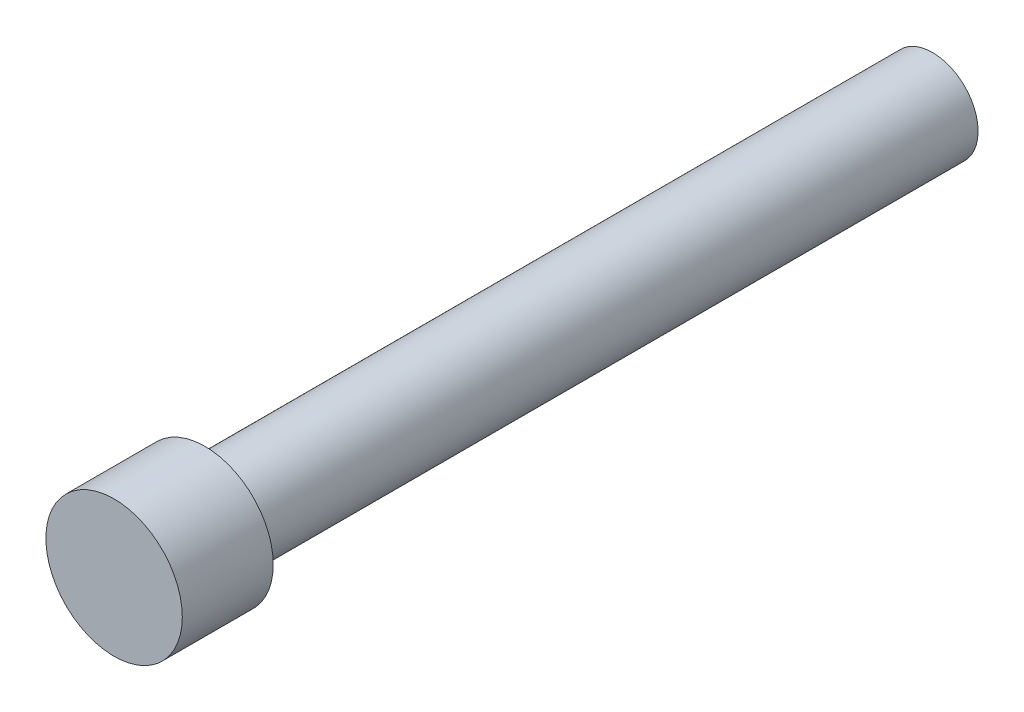
ISO-10303-21;
HEADER;
FILE_DESCRIPTION(('STEP AP214'),'2;1');
FILE_NAME('part.step','',(''),(''),'','','');
FILE_SCHEMA(('AUTOMOTIVE_DESIGN { 1 0 10303 214 1 1 1 1 }'));
ENDSEC;
DATA;
#1=APPLICATION_CONTEXT('core data for automotive mechanical design processes');
#2=APPLICATION_PROTOCOL_DEFINITION('international standard','automotive_design',2000,#1);
#3=PRODUCT_CONTEXT('',#1,'mechanical');
#4=PRODUCT('Part','Part','',(#3));
#5=PRODUCT_RELATED_PRODUCT_CATEGORY('part','',(#4));
#6=PRODUCT_DEFINITION_FORMATION('','',#4);
#7=PRODUCT_DEFINITION_CONTEXT('part definition',#1,'design');
#8=PRODUCT_DEFINITION('design','',#6,#7);
#9=PRODUCT_DEFINITION_SHAPE('','',#8);
#10=(LENGTH_UNIT() NAMED_UNIT(*) SI_UNIT(.MILLI.,.METRE.));
#11=(NAMED_UNIT(*) PLANE_ANGLE_UNIT() SI_UNIT($,.RADIAN.));
#12=(NAMED_UNIT(*) SI_UNIT($,.STERADIAN.) SOLID_ANGLE_UNIT());
#13=UNCERTAINTY_MEASURE_WITH_UNIT(LENGTH_MEASURE(1.E-05),#10,'distance_accuracy_value','');
#14=(GEOMETRIC_REPRESENTATION_CONTEXT(3) GLOBAL_UNCERTAINTY_ASSIGNED_CONTEXT((#13)) GLOBAL_UNIT_ASSIGNED_CONTEXT((#10,
#11,#12)) REPRESENTATION_CONTEXT('',''));
#15=CARTESIAN_POINT('',(0.,0.,0.));
#16=DIRECTION('',(0.,0.,1.));
#17=DIRECTION('',(1.,0.,0.));
#18=AXIS2_PLACEMENT_3D('',#15,#16,#17);
#19=CARTESIAN_POINT('',(0.,0.,2.));
#20=DIRECTION('',(0.,0.,-1.));
#21=DIRECTION('',(-1.,0.,0.));
#22=AXIS2_PLACEMENT_3D('',#19,#20,#21);
#23=CYLINDRICAL_SURFACE('',#22,1.5);
#24=CARTESIAN_POINT('',(0.,0.,2.));
#25=DIRECTION('',(0.,0.,1.));
#26=DIRECTION('',(1.,0.,0.));
#27=AXIS2_PLACEMENT_3D('',#24,#25,#26);
#28=CIRCLE('',#27,1.5);
#29=CARTESIAN_POINT('',(1.5,0.,2.));
#30=VERTEX_POINT('',#29);
#31=EDGE_CURVE('E45',#30,#30,#28,.T.);
#32=ORIENTED_EDGE('',*,*,#31,.F.);
#33=EDGE_LOOP('',(#32));
#34=FACE_BOUND('',#33,.T.);
#35=CARTESIAN_POINT('',(0.,0.,0.));
#36=DIRECTION('',(0.,0.,1.));
#37=DIRECTION('',(1.,0.,0.));
#38=AXIS2_PLACEMENT_3D('',#35,#36,#37);
#39=CIRCLE('',#38,1.5);
#40=CARTESIAN_POINT('',(1.5,0.,0.));
#41=VERTEX_POINT('',#40);
#42=EDGE_CURVE('E40',#41,#41,#39,.T.);
#43=ORIENTED_EDGE('',*,*,#42,.T.);
#44=EDGE_LOOP('',(#43));
#45=FACE_BOUND('',#44,.T.);
#46=ADVANCED_FACE('F37',(#34,#45),#23,.T.);
#47=CARTESIAN_POINT('',(0.,0.,2.));
#48=DIRECTION('',(0.,0.,1.));
#49=DIRECTION('',(1.,0.,0.));
#50=AXIS2_PLACEMENT_3D('',#47,#48,#49);
#51=PLANE('',#50);
#52=ORIENTED_EDGE('',*,*,#31,.T.);
#53=EDGE_LOOP('',(#52));
#54=FACE_BOUND('',#53,.T.);
#55=ADVANCED_FACE('F65',(#54),#51,.T.);
#56=CARTESIAN_POINT('',(0.,0.,0.));
#57=DIRECTION('',(0.,0.,1.));
#58=DIRECTION('',(1.,0.,0.));
#59=AXIS2_PLACEMENT_3D('',#56,#57,#58);
#60=PLANE('',#59);
#61=CARTESIAN_POINT('',(0.,0.,0.));
#62=DIRECTION('',(0.,0.,-1.));
#63=DIRECTION('',(-1.,0.,0.));
#64=AXIS2_PLACEMENT_3D('',#61,#62,#63);
#65=CIRCLE('',#64,1.);
#66=CARTESIAN_POINT('',(-1.,0.,0.));
#67=VERTEX_POINT('',#66);
#68=EDGE_CURVE('E10',#67,#67,#65,.T.);
#69=ORIENTED_EDGE('',*,*,#68,.F.);
#70=EDGE_LOOP('',(#69));
#71=FACE_BOUND('',#70,.T.);
#72=ORIENTED_EDGE('',*,*,#42,.F.);
#73=EDGE_LOOP('',(#72));
#74=FACE_BOUND('',#73,.T.);
#75=ADVANCED_FACE('F62',(#71,#74),#60,.F.);
#76=CARTESIAN_POINT('',(0.,0.,-16.));
#77=DIRECTION('',(0.,0.,1.));
#78=DIRECTION('',(1.,0.,0.));
#79=AXIS2_PLACEMENT_3D('',#76,#77,#78);
#80=CYLINDRICAL_SURFACE('',#79,1.);
#81=CARTESIAN_POINT('',(0.,0.,-16.));
#82=DIRECTION('',(0.,0.,-1.));
#83=DIRECTION('',(-1.,0.,0.));
#84=AXIS2_PLACEMENT_3D('',#81,#82,#83);
#85=CIRCLE('',#84,1.);
#86=CARTESIAN_POINT('',(-1.,0.,-16.));
#87=VERTEX_POINT('',#86);
#88=EDGE_CURVE('E52',#87,#87,#85,.T.);
#89=ORIENTED_EDGE('',*,*,#88,.F.);
#90=EDGE_LOOP('',(#89));
#91=FACE_BOUND('',#90,.T.);
#92=ORIENTED_EDGE('',*,*,#68,.T.);
#93=EDGE_LOOP('',(#92));
#94=FACE_BOUND('',#93,.T.);
#95=ADVANCED_FACE('F64',(#91,#94),#80,.T.);
#96=CARTESIAN_POINT('',(0.,0.,-16.));
#97=DIRECTION('',(0.,0.,-1.));
#98=DIRECTION('',(-1.,0.,0.));
#99=AXIS2_PLACEMENT_3D('',#96,#97,#98);
#100=PLANE('',#99);
#101=ORIENTED_EDGE('',*,*,#88,.T.);
#102=EDGE_LOOP('',(#101));
#103=FACE_BOUND('',#102,.T.);
#104=ADVANCED_FACE('F71',(#103),#100,.T.);
#105=CLOSED_SHELL('',(#46,#55,#75,#95,#104));
#106=MANIFOLD_SOLID_BREP('B2',#105);
#107=ADVANCED_BREP_SHAPE_REPRESENTATION('',(#18,#106),#14);
#108=SHAPE_DEFINITION_REPRESENTATION(#9,#107);
ENDSEC;
END-ISO-10303-21;
